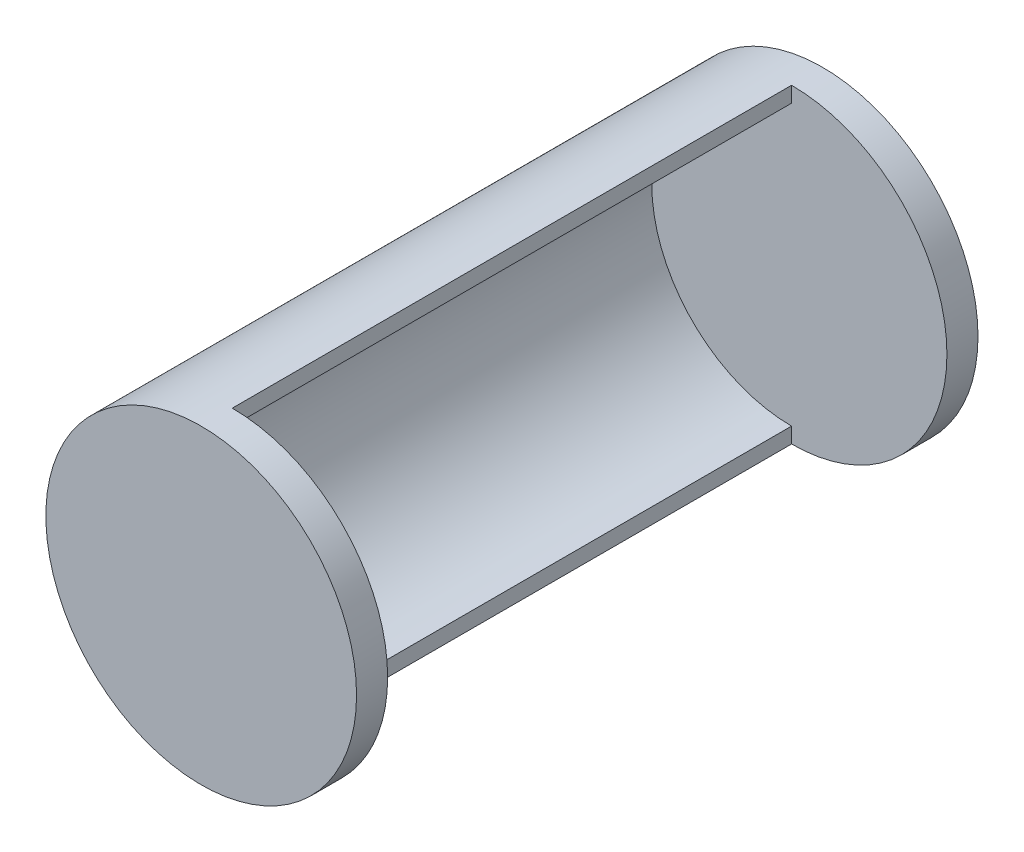
ISO-10303-21;
HEADER;
FILE_DESCRIPTION(('STEP AP214'),'2;1');
FILE_NAME('part.step','',(''),(''),'','','');
FILE_SCHEMA(('AUTOMOTIVE_DESIGN { 1 0 10303 214 1 1 1 1 }'));
ENDSEC;
DATA;
#1=APPLICATION_CONTEXT('core data for automotive mechanical design processes');
#2=APPLICATION_PROTOCOL_DEFINITION('international standard','automotive_design',2000,#1);
#3=PRODUCT_CONTEXT('',#1,'mechanical');
#4=PRODUCT('Part','Part','',(#3));
#5=PRODUCT_RELATED_PRODUCT_CATEGORY('part','',(#4));
#6=PRODUCT_DEFINITION_FORMATION('','',#4);
#7=PRODUCT_DEFINITION_CONTEXT('part definition',#1,'design');
#8=PRODUCT_DEFINITION('design','',#6,#7);
#9=PRODUCT_DEFINITION_SHAPE('','',#8);
#10=(LENGTH_UNIT() NAMED_UNIT(*) SI_UNIT(.MILLI.,.METRE.));
#11=(NAMED_UNIT(*) PLANE_ANGLE_UNIT() SI_UNIT($,.RADIAN.));
#12=(NAMED_UNIT(*) SI_UNIT($,.STERADIAN.) SOLID_ANGLE_UNIT());
#13=UNCERTAINTY_MEASURE_WITH_UNIT(LENGTH_MEASURE(1.E-05),#10,'distance_accuracy_value','');
#14=(GEOMETRIC_REPRESENTATION_CONTEXT(3) GLOBAL_UNCERTAINTY_ASSIGNED_CONTEXT((#13)) GLOBAL_UNIT_ASSIGNED_CONTEXT((#10,
#11,#12)) REPRESENTATION_CONTEXT('',''));
#15=CARTESIAN_POINT('',(0.,0.,0.));
#16=DIRECTION('',(0.,0.,1.));
#17=DIRECTION('',(1.,0.,0.));
#18=AXIS2_PLACEMENT_3D('',#15,#16,#17);
#19=CARTESIAN_POINT('',(0.,0.,10.));
#20=DIRECTION('',(0.,0.,-1.));
#21=DIRECTION('',(-1.,0.,0.));
#22=AXIS2_PLACEMENT_3D('',#19,#20,#21);
#23=CYLINDRICAL_SURFACE('',#22,50.);
#24=CARTESIAN_POINT('',(0.,0.,10.));
#25=DIRECTION('',(0.,0.,1.));
#26=DIRECTION('',(1.,0.,0.));
#27=AXIS2_PLACEMENT_3D('',#24,#25,#26);
#28=CIRCLE('',#27,50.);
#29=CARTESIAN_POINT('',(0.,-50.,10.));
#30=VERTEX_POINT('',#29);
#31=CARTESIAN_POINT('',(0.,50.,10.));
#32=VERTEX_POINT('',#31);
#33=EDGE_CURVE('E11',#30,#32,#28,.T.);
#34=ORIENTED_EDGE('',*,*,#33,.F.);
#35=DIRECTION('',(0.,0.,-1.));
#36=VECTOR('',#35,1.);
#37=CARTESIAN_POINT('',(0.,-50.,190.));
#38=LINE('',#37,#36);
#39=CARTESIAN_POINT('',(0.,-50.,190.));
#40=VERTEX_POINT('',#39);
#41=EDGE_CURVE('E98',#40,#30,#38,.T.);
#42=ORIENTED_EDGE('',*,*,#41,.F.);
#43=CARTESIAN_POINT('',(0.,0.,190.));
#44=DIRECTION('',(0.,0.,1.));
#45=DIRECTION('',(1.,0.,0.));
#46=AXIS2_PLACEMENT_3D('',#43,#44,#45);
#47=CIRCLE('',#46,50.);
#48=CARTESIAN_POINT('',(0.,50.,190.));
#49=VERTEX_POINT('',#48);
#50=EDGE_CURVE('E93',#40,#49,#47,.T.);
#51=ORIENTED_EDGE('',*,*,#50,.T.);
#52=DIRECTION('',(0.,0.,-1.));
#53=VECTOR('',#52,1.);
#54=CARTESIAN_POINT('',(0.,50.,190.));
#55=LINE('',#54,#53);
#56=EDGE_CURVE('E76',#49,#32,#55,.T.);
#57=ORIENTED_EDGE('',*,*,#56,.T.);
#58=EDGE_LOOP('',(#34,#42,#51,#57));
#59=FACE_BOUND('',#58,.T.);
#60=CARTESIAN_POINT('',(0.,0.,0.));
#61=DIRECTION('',(0.,0.,1.));
#62=DIRECTION('',(1.,0.,0.));
#63=AXIS2_PLACEMENT_3D('',#60,#61,#62);
#64=CIRCLE('',#63,50.);
#65=CARTESIAN_POINT('',(50.,0.,0.));
#66=VERTEX_POINT('',#65);
#67=EDGE_CURVE('E45',#66,#66,#64,.T.);
#68=ORIENTED_EDGE('',*,*,#67,.T.);
#69=EDGE_LOOP('',(#68));
#70=FACE_BOUND('',#69,.T.);
#71=CARTESIAN_POINT('',(0.,0.,200.));
#72=DIRECTION('',(0.,0.,1.));
#73=DIRECTION('',(1.,0.,0.));
#74=AXIS2_PLACEMENT_3D('',#71,#72,#73);
#75=CIRCLE('',#74,50.);
#76=CARTESIAN_POINT('',(50.,0.,200.));
#77=VERTEX_POINT('',#76);
#78=EDGE_CURVE('E97',#77,#77,#75,.T.);
#79=ORIENTED_EDGE('',*,*,#78,.F.);
#80=EDGE_LOOP('',(#79));
#81=FACE_BOUND('',#80,.T.);
#82=ADVANCED_FACE('F39',(#59,#70,#81),#23,.T.);
#83=CARTESIAN_POINT('',(0.,0.,10.));
#84=DIRECTION('',(0.,0.,1.));
#85=DIRECTION('',(1.,0.,0.));
#86=AXIS2_PLACEMENT_3D('',#83,#84,#85);
#87=PLANE('',#86);
#88=DIRECTION('',(0.,1.,0.));
#89=VECTOR('',#88,1.);
#90=CARTESIAN_POINT('',(0.,50.,10.));
#91=LINE('',#90,#89);
#92=CARTESIAN_POINT('',(0.,45.,10.));
#93=VERTEX_POINT('',#92);
#94=EDGE_CURVE('E55',#93,#32,#91,.T.);
#95=ORIENTED_EDGE('',*,*,#94,.F.);
#96=CARTESIAN_POINT('',(0.,0.,10.));
#97=DIRECTION('',(0.,0.,-1.));
#98=DIRECTION('',(1.,0.,0.));
#99=AXIS2_PLACEMENT_3D('',#96,#97,#98);
#100=CIRCLE('',#99,45.);
#101=CARTESIAN_POINT('',(0.,-45.,10.));
#102=VERTEX_POINT('',#101);
#103=EDGE_CURVE('E107',#102,#93,#100,.T.);
#104=ORIENTED_EDGE('',*,*,#103,.F.);
#105=DIRECTION('',(0.,1.,0.));
#106=VECTOR('',#105,1.);
#107=CARTESIAN_POINT('',(0.,-50.,10.));
#108=LINE('',#107,#106);
#109=EDGE_CURVE('E60',#30,#102,#108,.T.);
#110=ORIENTED_EDGE('',*,*,#109,.F.);
#111=ORIENTED_EDGE('',*,*,#33,.T.);
#112=EDGE_LOOP('',(#95,#104,#110,#111));
#113=FACE_BOUND('',#112,.T.);
#114=ADVANCED_FACE('F122',(#113),#87,.T.);
#115=CARTESIAN_POINT('',(0.,0.,0.));
#116=DIRECTION('',(0.,0.,1.));
#117=DIRECTION('',(1.,0.,0.));
#118=AXIS2_PLACEMENT_3D('',#115,#116,#117);
#119=PLANE('',#118);
#120=ORIENTED_EDGE('',*,*,#67,.F.);
#121=EDGE_LOOP('',(#120));
#122=FACE_BOUND('',#121,.T.);
#123=ADVANCED_FACE('F117',(#122),#119,.F.);
#124=CARTESIAN_POINT('',(0.,-50.,190.));
#125=DIRECTION('',(-1.,0.,0.));
#126=DIRECTION('',(0.,-1.,0.));
#127=AXIS2_PLACEMENT_3D('',#124,#125,#126);
#128=PLANE('',#127);
#129=ORIENTED_EDGE('',*,*,#109,.T.);
#130=DIRECTION('',(0.,0.,-1.));
#131=VECTOR('',#130,1.);
#132=CARTESIAN_POINT('',(0.,-45.,190.));
#133=LINE('',#132,#131);
#134=CARTESIAN_POINT('',(0.,-45.,190.));
#135=VERTEX_POINT('',#134);
#136=EDGE_CURVE('E115',#135,#102,#133,.T.);
#137=ORIENTED_EDGE('',*,*,#136,.F.);
#138=DIRECTION('',(0.,1.,0.));
#139=VECTOR('',#138,1.);
#140=CARTESIAN_POINT('',(0.,-50.,190.));
#141=LINE('',#140,#139);
#142=EDGE_CURVE('E102',#40,#135,#141,.T.);
#143=ORIENTED_EDGE('',*,*,#142,.F.);
#144=ORIENTED_EDGE('',*,*,#41,.T.);
#145=EDGE_LOOP('',(#129,#137,#143,#144));
#146=FACE_BOUND('',#145,.T.);
#147=ADVANCED_FACE('F125',(#146),#128,.F.);
#148=CARTESIAN_POINT('',(0.,0.,190.));
#149=DIRECTION('',(0.,0.,-1.));
#150=DIRECTION('',(-1.,0.,0.));
#151=AXIS2_PLACEMENT_3D('',#148,#149,#150);
#152=CYLINDRICAL_SURFACE('',#151,45.);
#153=ORIENTED_EDGE('',*,*,#103,.T.);
#154=DIRECTION('',(0.,0.,-1.));
#155=VECTOR('',#154,1.);
#156=CARTESIAN_POINT('',(0.,45.,190.));
#157=LINE('',#156,#155);
#158=CARTESIAN_POINT('',(0.,45.,190.));
#159=VERTEX_POINT('',#158);
#160=EDGE_CURVE('E84',#159,#93,#157,.T.);
#161=ORIENTED_EDGE('',*,*,#160,.F.);
#162=CARTESIAN_POINT('',(0.,0.,190.));
#163=DIRECTION('',(0.,0.,-1.));
#164=DIRECTION('',(1.,0.,0.));
#165=AXIS2_PLACEMENT_3D('',#162,#163,#164);
#166=CIRCLE('',#165,45.);
#167=EDGE_CURVE('E91',#135,#159,#166,.T.);
#168=ORIENTED_EDGE('',*,*,#167,.F.);
#169=ORIENTED_EDGE('',*,*,#136,.T.);
#170=EDGE_LOOP('',(#153,#161,#168,#169));
#171=FACE_BOUND('',#170,.T.);
#172=ADVANCED_FACE('F126',(#171),#152,.F.);
#173=CARTESIAN_POINT('',(0.,50.,190.));
#174=DIRECTION('',(-1.,0.,0.));
#175=DIRECTION('',(0.,-1.,0.));
#176=AXIS2_PLACEMENT_3D('',#173,#174,#175);
#177=PLANE('',#176);
#178=ORIENTED_EDGE('',*,*,#94,.T.);
#179=ORIENTED_EDGE('',*,*,#56,.F.);
#180=DIRECTION('',(0.,1.,0.));
#181=VECTOR('',#180,1.);
#182=CARTESIAN_POINT('',(0.,50.,190.));
#183=LINE('',#182,#181);
#184=EDGE_CURVE('E81',#159,#49,#183,.T.);
#185=ORIENTED_EDGE('',*,*,#184,.F.);
#186=ORIENTED_EDGE('',*,*,#160,.T.);
#187=EDGE_LOOP('',(#178,#179,#185,#186));
#188=FACE_BOUND('',#187,.T.);
#189=ADVANCED_FACE('F78',(#188),#177,.F.);
#190=CARTESIAN_POINT('',(0.,0.,190.));
#191=DIRECTION('',(0.,0.,1.));
#192=DIRECTION('',(1.,0.,0.));
#193=AXIS2_PLACEMENT_3D('',#190,#191,#192);
#194=PLANE('',#193);
#195=ORIENTED_EDGE('',*,*,#50,.F.);
#196=ORIENTED_EDGE('',*,*,#142,.T.);
#197=ORIENTED_EDGE('',*,*,#167,.T.);
#198=ORIENTED_EDGE('',*,*,#184,.T.);
#199=EDGE_LOOP('',(#195,#196,#197,#198));
#200=FACE_BOUND('',#199,.T.);
#201=ADVANCED_FACE('F90',(#200),#194,.F.);
#202=CARTESIAN_POINT('',(0.,0.,200.));
#203=DIRECTION('',(0.,0.,1.));
#204=DIRECTION('',(1.,0.,0.));
#205=AXIS2_PLACEMENT_3D('',#202,#203,#204);
#206=PLANE('',#205);
#207=ORIENTED_EDGE('',*,*,#78,.T.);
#208=EDGE_LOOP('',(#207));
#209=FACE_BOUND('',#208,.T.);
#210=ADVANCED_FACE('F162',(#209),#206,.T.);
#211=CLOSED_SHELL('',(#82,#114,#123,#147,#172,#189,#201,#210));
#212=MANIFOLD_SOLID_BREP('B2',#211);
#213=ADVANCED_BREP_SHAPE_REPRESENTATION('',(#18,#212),#14);
#214=SHAPE_DEFINITION_REPRESENTATION(#9,#213);
ENDSEC;
END-ISO-10303-21;
